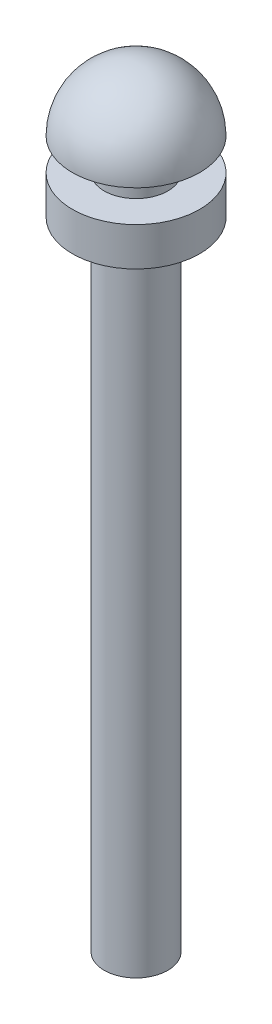
ISO-10303-21;
HEADER;
FILE_DESCRIPTION(('STEP AP214'),'2;1');
FILE_NAME('part.step','',(''),(''),'','','');
FILE_SCHEMA(('AUTOMOTIVE_DESIGN { 1 0 10303 214 1 1 1 1 }'));
ENDSEC;
DATA;
#1=APPLICATION_CONTEXT('core data for automotive mechanical design processes');
#2=APPLICATION_PROTOCOL_DEFINITION('international standard','automotive_design',2000,#1);
#3=PRODUCT_CONTEXT('',#1,'mechanical');
#4=PRODUCT('Part','Part','',(#3));
#5=PRODUCT_RELATED_PRODUCT_CATEGORY('part','',(#4));
#6=PRODUCT_DEFINITION_FORMATION('','',#4);
#7=PRODUCT_DEFINITION_CONTEXT('part definition',#1,'design');
#8=PRODUCT_DEFINITION('design','',#6,#7);
#9=PRODUCT_DEFINITION_SHAPE('','',#8);
#10=(LENGTH_UNIT() NAMED_UNIT(*) SI_UNIT(.MILLI.,.METRE.));
#11=(NAMED_UNIT(*) PLANE_ANGLE_UNIT() SI_UNIT($,.RADIAN.));
#12=(NAMED_UNIT(*) SI_UNIT($,.STERADIAN.) SOLID_ANGLE_UNIT());
#13=UNCERTAINTY_MEASURE_WITH_UNIT(LENGTH_MEASURE(1.E-05),#10,'distance_accuracy_value','');
#14=(GEOMETRIC_REPRESENTATION_CONTEXT(3) GLOBAL_UNCERTAINTY_ASSIGNED_CONTEXT((#13)) GLOBAL_UNIT_ASSIGNED_CONTEXT((#10,
#11,#12)) REPRESENTATION_CONTEXT('',''));
#15=CARTESIAN_POINT('',(0.,0.,0.));
#16=DIRECTION('',(0.,0.,1.));
#17=DIRECTION('',(1.,0.,0.));
#18=AXIS2_PLACEMENT_3D('',#15,#16,#17);
#19=CARTESIAN_POINT('',(0.,0.,0.));
#20=DIRECTION('',(0.,-1.,0.));
#21=DIRECTION('',(0.,0.,-1.));
#22=AXIS2_PLACEMENT_3D('',#19,#20,#21);
#23=PLANE('',#22);
#24=CARTESIAN_POINT('',(0.,0.,0.));
#25=DIRECTION('',(0.,-1.,0.));
#26=DIRECTION('',(0.,0.,-1.));
#27=AXIS2_PLACEMENT_3D('',#24,#25,#26);
#28=CIRCLE('',#27,1.);
#29=CARTESIAN_POINT('',(0.,0.,-1.));
#30=VERTEX_POINT('',#29);
#31=EDGE_CURVE('E10',#30,#30,#28,.T.);
#32=ORIENTED_EDGE('',*,*,#31,.T.);
#33=EDGE_LOOP('',(#32));
#34=FACE_BOUND('',#33,.T.);
#35=ADVANCED_FACE('F31',(#34),#23,.T.);
#36=CARTESIAN_POINT('',(0.,0.,0.));
#37=DIRECTION('',(0.,-1.,0.));
#38=DIRECTION('',(0.,0.,-1.));
#39=AXIS2_PLACEMENT_3D('',#36,#37,#38);
#40=CYLINDRICAL_SURFACE('',#39,1.);
#41=CARTESIAN_POINT('',(0.,20.,0.));
#42=DIRECTION('',(0.,-1.,0.));
#43=DIRECTION('',(0.,0.,-1.));
#44=AXIS2_PLACEMENT_3D('',#41,#42,#43);
#45=CIRCLE('',#44,1.);
#46=CARTESIAN_POINT('',(0.,20.,-1.));
#47=VERTEX_POINT('',#46);
#48=EDGE_CURVE('E37',#47,#47,#45,.T.);
#49=ORIENTED_EDGE('',*,*,#48,.T.);
#50=EDGE_LOOP('',(#49));
#51=FACE_BOUND('',#50,.T.);
#52=ORIENTED_EDGE('',*,*,#31,.F.);
#53=EDGE_LOOP('',(#52));
#54=FACE_BOUND('',#53,.T.);
#55=ADVANCED_FACE('F72',(#51,#54),#40,.T.);
#56=CARTESIAN_POINT('',(1.,20.,0.));
#57=DIRECTION('',(0.,-1.,0.));
#58=DIRECTION('',(0.,0.,-1.));
#59=AXIS2_PLACEMENT_3D('',#56,#57,#58);
#60=PLANE('',#59);
#61=CARTESIAN_POINT('',(0.,20.,0.));
#62=DIRECTION('',(0.,-1.,0.));
#63=DIRECTION('',(0.,0.,-1.));
#64=AXIS2_PLACEMENT_3D('',#61,#62,#63);
#65=CIRCLE('',#64,2.);
#66=CARTESIAN_POINT('',(0.,20.,-2.));
#67=VERTEX_POINT('',#66);
#68=EDGE_CURVE('E41',#67,#67,#65,.T.);
#69=ORIENTED_EDGE('',*,*,#68,.T.);
#70=EDGE_LOOP('',(#69));
#71=FACE_BOUND('',#70,.T.);
#72=ORIENTED_EDGE('',*,*,#48,.F.);
#73=EDGE_LOOP('',(#72));
#74=FACE_BOUND('',#73,.T.);
#75=ADVANCED_FACE('F76',(#71,#74),#60,.T.);
#76=CARTESIAN_POINT('',(0.,0.,0.));
#77=DIRECTION('',(0.,-1.,0.));
#78=DIRECTION('',(0.,0.,-1.));
#79=AXIS2_PLACEMENT_3D('',#76,#77,#78);
#80=CYLINDRICAL_SURFACE('',#79,2.);
#81=CARTESIAN_POINT('',(0.,21.2093023255814,0.));
#82=DIRECTION('',(0.,-1.,0.));
#83=DIRECTION('',(0.,0.,-1.));
#84=AXIS2_PLACEMENT_3D('',#81,#82,#83);
#85=CIRCLE('',#84,2.);
#86=CARTESIAN_POINT('',(0.,21.2093023255814,-2.));
#87=VERTEX_POINT('',#86);
#88=EDGE_CURVE('E45',#87,#87,#85,.T.);
#89=ORIENTED_EDGE('',*,*,#88,.T.);
#90=EDGE_LOOP('',(#89));
#91=FACE_BOUND('',#90,.T.);
#92=ORIENTED_EDGE('',*,*,#68,.F.);
#93=EDGE_LOOP('',(#92));
#94=FACE_BOUND('',#93,.T.);
#95=ADVANCED_FACE('F80',(#91,#94),#80,.T.);
#96=CARTESIAN_POINT('',(2.,21.2093023255814,0.));
#97=DIRECTION('',(0.,1.,0.));
#98=DIRECTION('',(0.,0.,1.));
#99=AXIS2_PLACEMENT_3D('',#96,#97,#98);
#100=PLANE('',#99);
#101=CARTESIAN_POINT('',(0.,21.2093023255814,0.));
#102=DIRECTION('',(0.,-1.,0.));
#103=DIRECTION('',(0.,0.,-1.));
#104=AXIS2_PLACEMENT_3D('',#101,#102,#103);
#105=CIRCLE('',#104,1.);
#106=CARTESIAN_POINT('',(0.,21.2093023255814,-1.));
#107=VERTEX_POINT('',#106);
#108=EDGE_CURVE('E50',#107,#107,#105,.T.);
#109=ORIENTED_EDGE('',*,*,#108,.T.);
#110=EDGE_LOOP('',(#109));
#111=FACE_BOUND('',#110,.T.);
#112=ORIENTED_EDGE('',*,*,#88,.F.);
#113=EDGE_LOOP('',(#112));
#114=FACE_BOUND('',#113,.T.);
#115=ADVANCED_FACE('F87',(#111,#114),#100,.T.);
#116=CARTESIAN_POINT('',(0.,0.,0.));
#117=DIRECTION('',(0.,-1.,0.));
#118=DIRECTION('',(0.,0.,-1.));
#119=AXIS2_PLACEMENT_3D('',#116,#117,#118);
#120=CYLINDRICAL_SURFACE('',#119,1.);
#121=CARTESIAN_POINT('',(0.,22.2093023255814,0.));
#122=DIRECTION('',(0.,-1.,0.));
#123=DIRECTION('',(0.,0.,-1.));
#124=AXIS2_PLACEMENT_3D('',#121,#122,#123);
#125=CIRCLE('',#124,1.);
#126=CARTESIAN_POINT('',(0.,22.2093023255814,-1.));
#127=VERTEX_POINT('',#126);
#128=EDGE_CURVE('E53',#127,#127,#125,.T.);
#129=ORIENTED_EDGE('',*,*,#128,.T.);
#130=EDGE_LOOP('',(#129));
#131=FACE_BOUND('',#130,.T.);
#132=ORIENTED_EDGE('',*,*,#108,.F.);
#133=EDGE_LOOP('',(#132));
#134=FACE_BOUND('',#133,.T.);
#135=ADVANCED_FACE('F69',(#131,#134),#120,.T.);
#136=CARTESIAN_POINT('',(1.,22.2093023255814,0.));
#137=DIRECTION('',(0.,-1.,0.));
#138=DIRECTION('',(0.,0.,-1.));
#139=AXIS2_PLACEMENT_3D('',#136,#137,#138);
#140=PLANE('',#139);
#141=CARTESIAN_POINT('',(0.,22.2093023255814,0.));
#142=DIRECTION('',(0.,-1.,0.));
#143=DIRECTION('',(0.,0.,-1.));
#144=AXIS2_PLACEMENT_3D('',#141,#142,#143);
#145=CIRCLE('',#144,2.);
#146=CARTESIAN_POINT('',(0.,22.2093023255814,-2.));
#147=VERTEX_POINT('',#146);
#148=EDGE_CURVE('E56',#147,#147,#145,.T.);
#149=ORIENTED_EDGE('',*,*,#148,.T.);
#150=EDGE_LOOP('',(#149));
#151=FACE_BOUND('',#150,.T.);
#152=ORIENTED_EDGE('',*,*,#128,.F.);
#153=EDGE_LOOP('',(#152));
#154=FACE_BOUND('',#153,.T.);
#155=ADVANCED_FACE('F60',(#151,#154),#140,.T.);
#156=CARTESIAN_POINT('',(0.,22.2093023255814,0.));
#157=DIRECTION('',(0.,-1.,0.));
#158=DIRECTION('',(1.,0.,0.));
#159=AXIS2_PLACEMENT_3D('',#156,#157,#158);
#160=SPHERICAL_SURFACE('',#159,2.);
#161=ORIENTED_EDGE('',*,*,#148,.F.);
#162=EDGE_LOOP('',(#161));
#163=FACE_BOUND('',#162,.T.);
#164=ADVANCED_FACE('F63',(#163),#160,.T.);
#165=CLOSED_SHELL('',(#35,#55,#75,#95,#115,#135,#155,#164));
#166=MANIFOLD_SOLID_BREP('B2',#165);
#167=ADVANCED_BREP_SHAPE_REPRESENTATION('',(#18,#166),#14);
#168=SHAPE_DEFINITION_REPRESENTATION(#9,#167);
ENDSEC;
END-ISO-10303-21;
